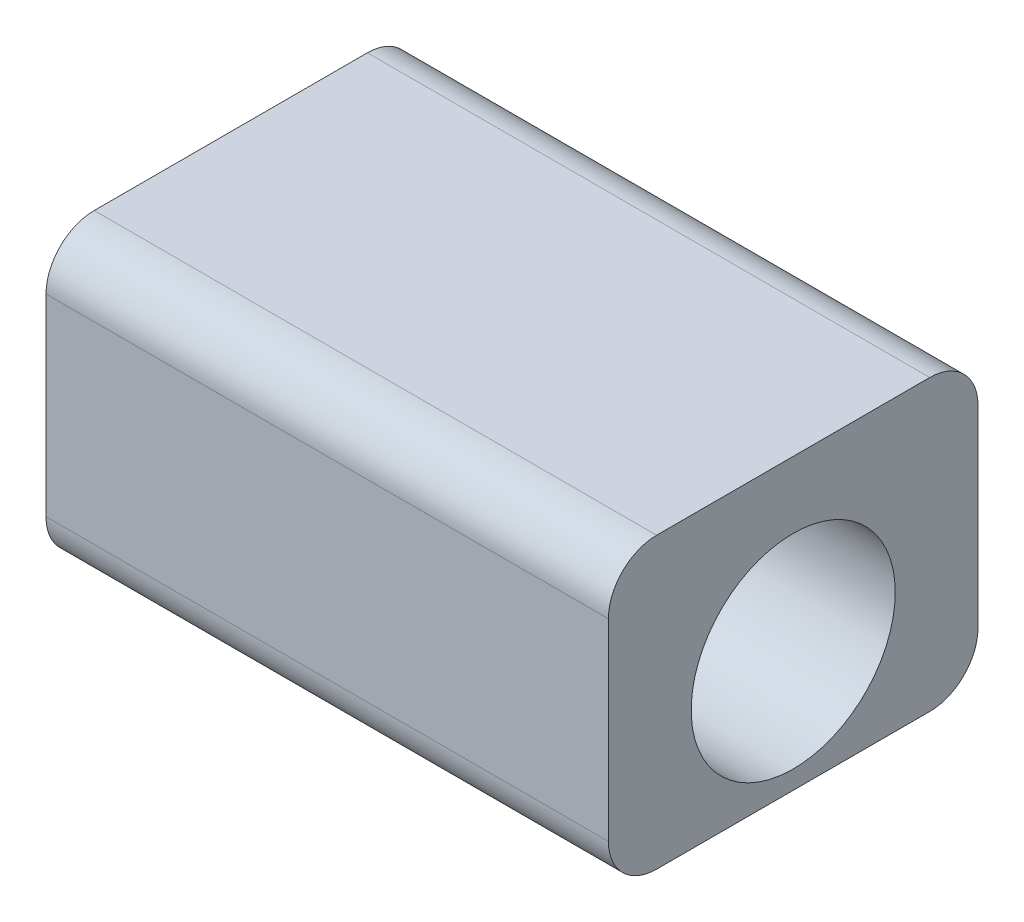
ISO-10303-21;
HEADER;
FILE_DESCRIPTION(('STEP AP214'),'2;1');
FILE_NAME('part.step','',(''),(''),'','','');
FILE_SCHEMA(('AUTOMOTIVE_DESIGN { 1 0 10303 214 1 1 1 1 }'));
ENDSEC;
DATA;
#1=APPLICATION_CONTEXT('core data for automotive mechanical design processes');
#2=APPLICATION_PROTOCOL_DEFINITION('international standard','automotive_design',2000,#1);
#3=PRODUCT_CONTEXT('',#1,'mechanical');
#4=PRODUCT('Part','Part','',(#3));
#5=PRODUCT_RELATED_PRODUCT_CATEGORY('part','',(#4));
#6=PRODUCT_DEFINITION_FORMATION('','',#4);
#7=PRODUCT_DEFINITION_CONTEXT('part definition',#1,'design');
#8=PRODUCT_DEFINITION('design','',#6,#7);
#9=PRODUCT_DEFINITION_SHAPE('','',#8);
#10=(LENGTH_UNIT() NAMED_UNIT(*) SI_UNIT(.MILLI.,.METRE.));
#11=(NAMED_UNIT(*) PLANE_ANGLE_UNIT() SI_UNIT($,.RADIAN.));
#12=(NAMED_UNIT(*) SI_UNIT($,.STERADIAN.) SOLID_ANGLE_UNIT());
#13=UNCERTAINTY_MEASURE_WITH_UNIT(LENGTH_MEASURE(1.E-05),#10,'distance_accuracy_value','');
#14=(GEOMETRIC_REPRESENTATION_CONTEXT(3) GLOBAL_UNCERTAINTY_ASSIGNED_CONTEXT((#13)) GLOBAL_UNIT_ASSIGNED_CONTEXT((#10,
#11,#12)) REPRESENTATION_CONTEXT('',''));
#15=CARTESIAN_POINT('',(0.,0.,0.));
#16=DIRECTION('',(0.,0.,1.));
#17=DIRECTION('',(1.,0.,0.));
#18=AXIS2_PLACEMENT_3D('',#15,#16,#17);
#19=CARTESIAN_POINT('',(35.,-9.,17.));
#20=DIRECTION('',(1.,0.,0.));
#21=DIRECTION('',(0.,0.,-1.));
#22=AXIS2_PLACEMENT_3D('',#19,#20,#21);
#23=PLANE('',#22);
#24=CARTESIAN_POINT('',(35.,-9.,17.));
#25=DIRECTION('',(1.,0.,0.));
#26=DIRECTION('',(0.,0.,-1.));
#27=AXIS2_PLACEMENT_3D('',#24,#25,#26);
#28=CIRCLE('',#27,6.);
#29=CARTESIAN_POINT('',(35.,-9.,23.));
#30=VERTEX_POINT('',#29);
#31=CARTESIAN_POINT('',(35.,-15.,17.));
#32=VERTEX_POINT('',#31);
#33=EDGE_CURVE('E151',#30,#32,#28,.T.);
#34=ORIENTED_EDGE('',*,*,#33,.T.);
#35=DIRECTION('',(0.,0.,-1.));
#36=VECTOR('',#35,1.);
#37=CARTESIAN_POINT('',(35.,-15.,17.));
#38=LINE('',#37,#36);
#39=CARTESIAN_POINT('',(35.,-15.,-17.));
#40=VERTEX_POINT('',#39);
#41=EDGE_CURVE('E99',#32,#40,#38,.T.);
#42=ORIENTED_EDGE('',*,*,#41,.T.);
#43=CARTESIAN_POINT('',(35.,-9.,-17.));
#44=DIRECTION('',(1.,0.,0.));
#45=DIRECTION('',(0.,0.,-1.));
#46=AXIS2_PLACEMENT_3D('',#43,#44,#45);
#47=CIRCLE('',#46,6.);
#48=CARTESIAN_POINT('',(35.,-9.,-23.));
#49=VERTEX_POINT('',#48);
#50=EDGE_CURVE('E166',#40,#49,#47,.T.);
#51=ORIENTED_EDGE('',*,*,#50,.T.);
#52=DIRECTION('',(0.,1.,0.));
#53=VECTOR('',#52,1.);
#54=CARTESIAN_POINT('',(35.,-9.,-23.));
#55=LINE('',#54,#53);
#56=CARTESIAN_POINT('',(35.,15.,-23.));
#57=VERTEX_POINT('',#56);
#58=EDGE_CURVE('E179',#49,#57,#55,.T.);
#59=ORIENTED_EDGE('',*,*,#58,.T.);
#60=CARTESIAN_POINT('',(35.,15.,-17.));
#61=DIRECTION('',(1.,0.,0.));
#62=DIRECTION('',(0.,0.,-1.));
#63=AXIS2_PLACEMENT_3D('',#60,#61,#62);
#64=CIRCLE('',#63,6.);
#65=CARTESIAN_POINT('',(35.,21.,-17.));
#66=VERTEX_POINT('',#65);
#67=EDGE_CURVE('E118',#57,#66,#64,.T.);
#68=ORIENTED_EDGE('',*,*,#67,.T.);
#69=DIRECTION('',(0.,0.,1.));
#70=VECTOR('',#69,1.);
#71=CARTESIAN_POINT('',(35.,21.,-17.));
#72=LINE('',#71,#70);
#73=CARTESIAN_POINT('',(35.,21.,17.));
#74=VERTEX_POINT('',#73);
#75=EDGE_CURVE('E112',#66,#74,#72,.T.);
#76=ORIENTED_EDGE('',*,*,#75,.T.);
#77=CARTESIAN_POINT('',(35.,15.,17.));
#78=DIRECTION('',(1.,0.,0.));
#79=DIRECTION('',(0.,0.,-1.));
#80=AXIS2_PLACEMENT_3D('',#77,#78,#79);
#81=CIRCLE('',#80,6.);
#82=CARTESIAN_POINT('',(35.,15.,23.));
#83=VERTEX_POINT('',#82);
#84=EDGE_CURVE('E116',#74,#83,#81,.T.);
#85=ORIENTED_EDGE('',*,*,#84,.T.);
#86=DIRECTION('',(0.,-1.,0.));
#87=VECTOR('',#86,1.);
#88=CARTESIAN_POINT('',(35.,15.,23.));
#89=LINE('',#88,#87);
#90=EDGE_CURVE('E56',#83,#30,#89,.T.);
#91=ORIENTED_EDGE('',*,*,#90,.T.);
#92=EDGE_LOOP('',(#34,#42,#51,#59,#68,#76,#85,#91));
#93=FACE_BOUND('',#92,.T.);
#94=CARTESIAN_POINT('',(35.,0.,0.));
#95=DIRECTION('',(1.,0.,0.));
#96=DIRECTION('',(0.,0.,-1.));
#97=AXIS2_PLACEMENT_3D('',#94,#95,#96);
#98=CIRCLE('',#97,12.7);
#99=CARTESIAN_POINT('',(35.,0.,-12.7));
#100=VERTEX_POINT('',#99);
#101=EDGE_CURVE('E140',#100,#100,#98,.T.);
#102=ORIENTED_EDGE('',*,*,#101,.F.);
#103=EDGE_LOOP('',(#102));
#104=FACE_BOUND('',#103,.T.);
#105=ADVANCED_FACE('F39',(#93,#104),#23,.T.);
#106=CARTESIAN_POINT('',(-35.,-9.,17.));
#107=DIRECTION('',(1.,0.,0.));
#108=DIRECTION('',(0.,0.,-1.));
#109=AXIS2_PLACEMENT_3D('',#106,#107,#108);
#110=PLANE('',#109);
#111=CARTESIAN_POINT('',(-35.,-9.,17.));
#112=DIRECTION('',(1.,0.,0.));
#113=DIRECTION('',(0.,0.,-1.));
#114=AXIS2_PLACEMENT_3D('',#111,#112,#113);
#115=CIRCLE('',#114,6.);
#116=CARTESIAN_POINT('',(-35.,-9.,23.));
#117=VERTEX_POINT('',#116);
#118=CARTESIAN_POINT('',(-35.,-15.,17.));
#119=VERTEX_POINT('',#118);
#120=EDGE_CURVE('E136',#117,#119,#115,.T.);
#121=ORIENTED_EDGE('',*,*,#120,.F.);
#122=DIRECTION('',(0.,-1.,0.));
#123=VECTOR('',#122,1.);
#124=CARTESIAN_POINT('',(-35.,15.,23.));
#125=LINE('',#124,#123);
#126=CARTESIAN_POINT('',(-35.,15.,23.));
#127=VERTEX_POINT('',#126);
#128=EDGE_CURVE('E91',#127,#117,#125,.T.);
#129=ORIENTED_EDGE('',*,*,#128,.F.);
#130=CARTESIAN_POINT('',(-35.,15.,17.));
#131=DIRECTION('',(1.,0.,0.));
#132=DIRECTION('',(0.,0.,-1.));
#133=AXIS2_PLACEMENT_3D('',#130,#131,#132);
#134=CIRCLE('',#133,6.);
#135=CARTESIAN_POINT('',(-35.,21.,17.));
#136=VERTEX_POINT('',#135);
#137=EDGE_CURVE('E85',#136,#127,#134,.T.);
#138=ORIENTED_EDGE('',*,*,#137,.F.);
#139=DIRECTION('',(0.,0.,1.));
#140=VECTOR('',#139,1.);
#141=CARTESIAN_POINT('',(-35.,21.,-17.));
#142=LINE('',#141,#140);
#143=CARTESIAN_POINT('',(-35.,21.,-17.));
#144=VERTEX_POINT('',#143);
#145=EDGE_CURVE('E126',#144,#136,#142,.T.);
#146=ORIENTED_EDGE('',*,*,#145,.F.);
#147=CARTESIAN_POINT('',(-35.,15.,-17.));
#148=DIRECTION('',(1.,0.,0.));
#149=DIRECTION('',(0.,0.,-1.));
#150=AXIS2_PLACEMENT_3D('',#147,#148,#149);
#151=CIRCLE('',#150,6.);
#152=CARTESIAN_POINT('',(-35.,15.,-23.));
#153=VERTEX_POINT('',#152);
#154=EDGE_CURVE('E146',#153,#144,#151,.T.);
#155=ORIENTED_EDGE('',*,*,#154,.F.);
#156=DIRECTION('',(0.,1.,0.));
#157=VECTOR('',#156,1.);
#158=CARTESIAN_POINT('',(-35.,-9.,-23.));
#159=LINE('',#158,#157);
#160=CARTESIAN_POINT('',(-35.,-9.,-23.));
#161=VERTEX_POINT('',#160);
#162=EDGE_CURVE('E144',#161,#153,#159,.T.);
#163=ORIENTED_EDGE('',*,*,#162,.F.);
#164=CARTESIAN_POINT('',(-35.,-9.,-17.));
#165=DIRECTION('',(1.,0.,0.));
#166=DIRECTION('',(0.,0.,-1.));
#167=AXIS2_PLACEMENT_3D('',#164,#165,#166);
#168=CIRCLE('',#167,6.);
#169=CARTESIAN_POINT('',(-35.,-15.,-17.));
#170=VERTEX_POINT('',#169);
#171=EDGE_CURVE('E142',#170,#161,#168,.T.);
#172=ORIENTED_EDGE('',*,*,#171,.F.);
#173=DIRECTION('',(0.,0.,-1.));
#174=VECTOR('',#173,1.);
#175=CARTESIAN_POINT('',(-35.,-15.,17.));
#176=LINE('',#175,#174);
#177=EDGE_CURVE('E139',#119,#170,#176,.T.);
#178=ORIENTED_EDGE('',*,*,#177,.F.);
#179=EDGE_LOOP('',(#121,#129,#138,#146,#155,#163,#172,#178));
#180=FACE_BOUND('',#179,.T.);
#181=CARTESIAN_POINT('',(-35.,0.,0.));
#182=DIRECTION('',(1.,0.,0.));
#183=DIRECTION('',(0.,0.,-1.));
#184=AXIS2_PLACEMENT_3D('',#181,#182,#183);
#185=CIRCLE('',#184,12.7);
#186=CARTESIAN_POINT('',(-35.,0.,-12.7));
#187=VERTEX_POINT('',#186);
#188=EDGE_CURVE('E185',#187,#187,#185,.T.);
#189=ORIENTED_EDGE('',*,*,#188,.T.);
#190=EDGE_LOOP('',(#189));
#191=FACE_BOUND('',#190,.T.);
#192=ADVANCED_FACE('F170',(#180,#191),#110,.F.);
#193=CARTESIAN_POINT('',(35.,-9.,17.));
#194=DIRECTION('',(-1.,0.,0.));
#195=DIRECTION('',(0.,0.,1.));
#196=AXIS2_PLACEMENT_3D('',#193,#194,#195);
#197=CYLINDRICAL_SURFACE('',#196,6.);
#198=ORIENTED_EDGE('',*,*,#120,.T.);
#199=DIRECTION('',(-1.,0.,0.));
#200=VECTOR('',#199,1.);
#201=CARTESIAN_POINT('',(35.,-15.,17.));
#202=LINE('',#201,#200);
#203=EDGE_CURVE('E11',#32,#119,#202,.T.);
#204=ORIENTED_EDGE('',*,*,#203,.F.);
#205=ORIENTED_EDGE('',*,*,#33,.F.);
#206=DIRECTION('',(-1.,0.,0.));
#207=VECTOR('',#206,1.);
#208=CARTESIAN_POINT('',(35.,-9.,23.));
#209=LINE('',#208,#207);
#210=EDGE_CURVE('E132',#30,#117,#209,.T.);
#211=ORIENTED_EDGE('',*,*,#210,.T.);
#212=EDGE_LOOP('',(#198,#204,#205,#211));
#213=FACE_BOUND('',#212,.T.);
#214=ADVANCED_FACE('F41',(#213),#197,.T.);
#215=CARTESIAN_POINT('',(35.,-15.,17.));
#216=DIRECTION('',(0.,1.,0.));
#217=DIRECTION('',(0.,0.,1.));
#218=AXIS2_PLACEMENT_3D('',#215,#216,#217);
#219=PLANE('',#218);
#220=ORIENTED_EDGE('',*,*,#177,.T.);
#221=DIRECTION('',(-1.,0.,0.));
#222=VECTOR('',#221,1.);
#223=CARTESIAN_POINT('',(35.,-15.,-17.));
#224=LINE('',#223,#222);
#225=EDGE_CURVE('E48',#40,#170,#224,.T.);
#226=ORIENTED_EDGE('',*,*,#225,.F.);
#227=ORIENTED_EDGE('',*,*,#41,.F.);
#228=ORIENTED_EDGE('',*,*,#203,.T.);
#229=EDGE_LOOP('',(#220,#226,#227,#228));
#230=FACE_BOUND('',#229,.T.);
#231=ADVANCED_FACE('F213',(#230),#219,.F.);
#232=CARTESIAN_POINT('',(35.,-9.,-17.));
#233=DIRECTION('',(-1.,0.,0.));
#234=DIRECTION('',(0.,0.,1.));
#235=AXIS2_PLACEMENT_3D('',#232,#233,#234);
#236=CYLINDRICAL_SURFACE('',#235,6.);
#237=ORIENTED_EDGE('',*,*,#171,.T.);
#238=DIRECTION('',(-1.,0.,0.));
#239=VECTOR('',#238,1.);
#240=CARTESIAN_POINT('',(35.,-9.,-23.));
#241=LINE('',#240,#239);
#242=EDGE_CURVE('E158',#49,#161,#241,.T.);
#243=ORIENTED_EDGE('',*,*,#242,.F.);
#244=ORIENTED_EDGE('',*,*,#50,.F.);
#245=ORIENTED_EDGE('',*,*,#225,.T.);
#246=EDGE_LOOP('',(#237,#243,#244,#245));
#247=FACE_BOUND('',#246,.T.);
#248=ADVANCED_FACE('F164',(#247),#236,.T.);
#249=CARTESIAN_POINT('',(35.,-9.,-23.));
#250=DIRECTION('',(0.,0.,1.));
#251=DIRECTION('',(1.,0.,0.));
#252=AXIS2_PLACEMENT_3D('',#249,#250,#251);
#253=PLANE('',#252);
#254=ORIENTED_EDGE('',*,*,#162,.T.);
#255=DIRECTION('',(-1.,0.,0.));
#256=VECTOR('',#255,1.);
#257=CARTESIAN_POINT('',(35.,15.,-23.));
#258=LINE('',#257,#256);
#259=EDGE_CURVE('E155',#57,#153,#258,.T.);
#260=ORIENTED_EDGE('',*,*,#259,.F.);
#261=ORIENTED_EDGE('',*,*,#58,.F.);
#262=ORIENTED_EDGE('',*,*,#242,.T.);
#263=EDGE_LOOP('',(#254,#260,#261,#262));
#264=FACE_BOUND('',#263,.T.);
#265=ADVANCED_FACE('F175',(#264),#253,.F.);
#266=CARTESIAN_POINT('',(35.,15.,-17.));
#267=DIRECTION('',(-1.,0.,0.));
#268=DIRECTION('',(0.,0.,1.));
#269=AXIS2_PLACEMENT_3D('',#266,#267,#268);
#270=CYLINDRICAL_SURFACE('',#269,6.);
#271=ORIENTED_EDGE('',*,*,#154,.T.);
#272=DIRECTION('',(-1.,0.,0.));
#273=VECTOR('',#272,1.);
#274=CARTESIAN_POINT('',(35.,21.,-17.));
#275=LINE('',#274,#273);
#276=EDGE_CURVE('E127',#66,#144,#275,.T.);
#277=ORIENTED_EDGE('',*,*,#276,.F.);
#278=ORIENTED_EDGE('',*,*,#67,.F.);
#279=ORIENTED_EDGE('',*,*,#259,.T.);
#280=EDGE_LOOP('',(#271,#277,#278,#279));
#281=FACE_BOUND('',#280,.T.);
#282=ADVANCED_FACE('F178',(#281),#270,.T.);
#283=CARTESIAN_POINT('',(35.,21.,-17.));
#284=DIRECTION('',(0.,-1.,0.));
#285=DIRECTION('',(0.,0.,-1.));
#286=AXIS2_PLACEMENT_3D('',#283,#284,#285);
#287=PLANE('',#286);
#288=ORIENTED_EDGE('',*,*,#145,.T.);
#289=DIRECTION('',(-1.,0.,0.));
#290=VECTOR('',#289,1.);
#291=CARTESIAN_POINT('',(35.,21.,17.));
#292=LINE('',#291,#290);
#293=EDGE_CURVE('E123',#74,#136,#292,.T.);
#294=ORIENTED_EDGE('',*,*,#293,.F.);
#295=ORIENTED_EDGE('',*,*,#75,.F.);
#296=ORIENTED_EDGE('',*,*,#276,.T.);
#297=EDGE_LOOP('',(#288,#294,#295,#296));
#298=FACE_BOUND('',#297,.T.);
#299=ADVANCED_FACE('F124',(#298),#287,.F.);
#300=CARTESIAN_POINT('',(35.,15.,17.));
#301=DIRECTION('',(-1.,0.,0.));
#302=DIRECTION('',(0.,0.,1.));
#303=AXIS2_PLACEMENT_3D('',#300,#301,#302);
#304=CYLINDRICAL_SURFACE('',#303,6.);
#305=ORIENTED_EDGE('',*,*,#137,.T.);
#306=DIRECTION('',(-1.,0.,0.));
#307=VECTOR('',#306,1.);
#308=CARTESIAN_POINT('',(35.,15.,23.));
#309=LINE('',#308,#307);
#310=EDGE_CURVE('E128',#83,#127,#309,.T.);
#311=ORIENTED_EDGE('',*,*,#310,.F.);
#312=ORIENTED_EDGE('',*,*,#84,.F.);
#313=ORIENTED_EDGE('',*,*,#293,.T.);
#314=EDGE_LOOP('',(#305,#311,#312,#313));
#315=FACE_BOUND('',#314,.T.);
#316=ADVANCED_FACE('F130',(#315),#304,.T.);
#317=CARTESIAN_POINT('',(35.,15.,23.));
#318=DIRECTION('',(0.,0.,-1.));
#319=DIRECTION('',(-1.,0.,0.));
#320=AXIS2_PLACEMENT_3D('',#317,#318,#319);
#321=PLANE('',#320);
#322=ORIENTED_EDGE('',*,*,#128,.T.);
#323=ORIENTED_EDGE('',*,*,#210,.F.);
#324=ORIENTED_EDGE('',*,*,#90,.F.);
#325=ORIENTED_EDGE('',*,*,#310,.T.);
#326=EDGE_LOOP('',(#322,#323,#324,#325));
#327=FACE_BOUND('',#326,.T.);
#328=ADVANCED_FACE('F201',(#327),#321,.F.);
#329=CARTESIAN_POINT('',(35.,0.,0.));
#330=DIRECTION('',(-1.,0.,0.));
#331=DIRECTION('',(0.,0.,1.));
#332=AXIS2_PLACEMENT_3D('',#329,#330,#331);
#333=CYLINDRICAL_SURFACE('',#332,12.7);
#334=ORIENTED_EDGE('',*,*,#101,.T.);
#335=EDGE_LOOP('',(#334));
#336=FACE_BOUND('',#335,.T.);
#337=ORIENTED_EDGE('',*,*,#188,.F.);
#338=EDGE_LOOP('',(#337));
#339=FACE_BOUND('',#338,.T.);
#340=ADVANCED_FACE('F191',(#336,#339),#333,.F.);
#341=CLOSED_SHELL('',(#105,#192,#214,#231,#248,#265,#282,#299,#316,#328,#340));
#342=MANIFOLD_SOLID_BREP('B2',#341);
#343=ADVANCED_BREP_SHAPE_REPRESENTATION('',(#18,#342),#14);
#344=SHAPE_DEFINITION_REPRESENTATION(#9,#343);
ENDSEC;
END-ISO-10303-21;
